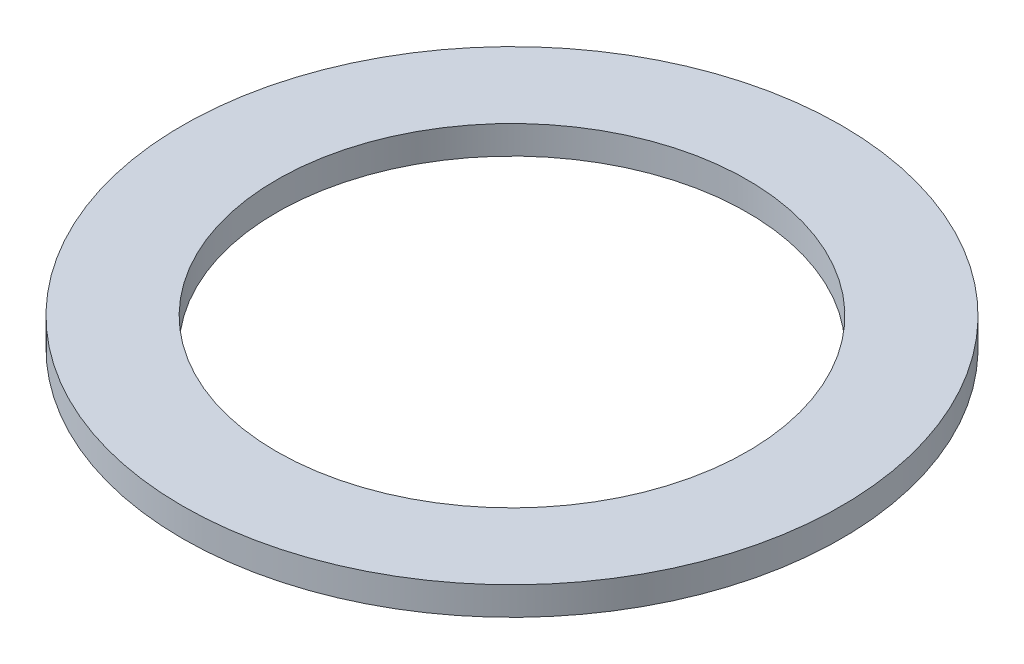
ISO-10303-21;
HEADER;
FILE_DESCRIPTION(('STEP AP214'),'2;1');
FILE_NAME('part.step','',(''),(''),'','','');
FILE_SCHEMA(('AUTOMOTIVE_DESIGN { 1 0 10303 214 1 1 1 1 }'));
ENDSEC;
DATA;
#1=APPLICATION_CONTEXT('core data for automotive mechanical design processes');
#2=APPLICATION_PROTOCOL_DEFINITION('international standard','automotive_design',2000,#1);
#3=PRODUCT_CONTEXT('',#1,'mechanical');
#4=PRODUCT('Part','Part','',(#3));
#5=PRODUCT_RELATED_PRODUCT_CATEGORY('part','',(#4));
#6=PRODUCT_DEFINITION_FORMATION('','',#4);
#7=PRODUCT_DEFINITION_CONTEXT('part definition',#1,'design');
#8=PRODUCT_DEFINITION('design','',#6,#7);
#9=PRODUCT_DEFINITION_SHAPE('','',#8);
#10=(LENGTH_UNIT() NAMED_UNIT(*) SI_UNIT(.MILLI.,.METRE.));
#11=(NAMED_UNIT(*) PLANE_ANGLE_UNIT() SI_UNIT($,.RADIAN.));
#12=(NAMED_UNIT(*) SI_UNIT($,.STERADIAN.) SOLID_ANGLE_UNIT());
#13=UNCERTAINTY_MEASURE_WITH_UNIT(LENGTH_MEASURE(1.E-05),#10,'distance_accuracy_value','');
#14=(GEOMETRIC_REPRESENTATION_CONTEXT(3) GLOBAL_UNCERTAINTY_ASSIGNED_CONTEXT((#13)) GLOBAL_UNIT_ASSIGNED_CONTEXT((#10,
#11,#12)) REPRESENTATION_CONTEXT('',''));
#15=CARTESIAN_POINT('',(0.,0.,0.));
#16=DIRECTION('',(0.,0.,1.));
#17=DIRECTION('',(1.,0.,0.));
#18=AXIS2_PLACEMENT_3D('',#15,#16,#17);
#19=CARTESIAN_POINT('',(0.,0.3,0.));
#20=DIRECTION('',(0.,1.,0.));
#21=DIRECTION('',(0.,0.,1.));
#22=AXIS2_PLACEMENT_3D('',#19,#20,#21);
#23=PLANE('',#22);
#24=CARTESIAN_POINT('',(0.,0.3,0.));
#25=DIRECTION('',(0.,1.,0.));
#26=DIRECTION('',(0.,0.,1.));
#27=AXIS2_PLACEMENT_3D('',#24,#25,#26);
#28=CIRCLE('',#27,3.5);
#29=CARTESIAN_POINT('',(0.,0.3,3.5));
#30=VERTEX_POINT('',#29);
#31=EDGE_CURVE('E10',#30,#30,#28,.T.);
#32=ORIENTED_EDGE('',*,*,#31,.T.);
#33=EDGE_LOOP('',(#32));
#34=FACE_BOUND('',#33,.T.);
#35=CARTESIAN_POINT('',(0.,0.3,0.));
#36=DIRECTION('',(0.,1.,0.));
#37=DIRECTION('',(0.,0.,1.));
#38=AXIS2_PLACEMENT_3D('',#35,#36,#37);
#39=CIRCLE('',#38,2.5);
#40=CARTESIAN_POINT('',(0.,0.3,2.5));
#41=VERTEX_POINT('',#40);
#42=EDGE_CURVE('E50',#41,#41,#39,.T.);
#43=ORIENTED_EDGE('',*,*,#42,.F.);
#44=EDGE_LOOP('',(#43));
#45=FACE_BOUND('',#44,.T.);
#46=ADVANCED_FACE('F37',(#34,#45),#23,.T.);
#47=CARTESIAN_POINT('',(0.,0.,0.));
#48=DIRECTION('',(0.,1.,0.));
#49=DIRECTION('',(0.,0.,1.));
#50=AXIS2_PLACEMENT_3D('',#47,#48,#49);
#51=PLANE('',#50);
#52=CARTESIAN_POINT('',(0.,0.,0.));
#53=DIRECTION('',(0.,1.,0.));
#54=DIRECTION('',(0.,0.,1.));
#55=AXIS2_PLACEMENT_3D('',#52,#53,#54);
#56=CIRCLE('',#55,3.5);
#57=CARTESIAN_POINT('',(0.,0.,3.5));
#58=VERTEX_POINT('',#57);
#59=EDGE_CURVE('E41',#58,#58,#56,.T.);
#60=ORIENTED_EDGE('',*,*,#59,.F.);
#61=EDGE_LOOP('',(#60));
#62=FACE_BOUND('',#61,.T.);
#63=CARTESIAN_POINT('',(0.,0.,0.));
#64=DIRECTION('',(0.,1.,0.));
#65=DIRECTION('',(0.,0.,1.));
#66=AXIS2_PLACEMENT_3D('',#63,#64,#65);
#67=CIRCLE('',#66,2.5);
#68=CARTESIAN_POINT('',(0.,0.,2.5));
#69=VERTEX_POINT('',#68);
#70=EDGE_CURVE('E52',#69,#69,#67,.T.);
#71=ORIENTED_EDGE('',*,*,#70,.T.);
#72=EDGE_LOOP('',(#71));
#73=FACE_BOUND('',#72,.T.);
#74=ADVANCED_FACE('F64',(#62,#73),#51,.F.);
#75=CARTESIAN_POINT('',(0.,0.3,0.));
#76=DIRECTION('',(0.,-1.,0.));
#77=DIRECTION('',(0.,0.,-1.));
#78=AXIS2_PLACEMENT_3D('',#75,#76,#77);
#79=CYLINDRICAL_SURFACE('',#78,3.5);
#80=ORIENTED_EDGE('',*,*,#31,.F.);
#81=EDGE_LOOP('',(#80));
#82=FACE_BOUND('',#81,.T.);
#83=ORIENTED_EDGE('',*,*,#59,.T.);
#84=EDGE_LOOP('',(#83));
#85=FACE_BOUND('',#84,.T.);
#86=ADVANCED_FACE('F39',(#82,#85),#79,.T.);
#87=CARTESIAN_POINT('',(0.,0.3,0.));
#88=DIRECTION('',(0.,-1.,0.));
#89=DIRECTION('',(0.,0.,-1.));
#90=AXIS2_PLACEMENT_3D('',#87,#88,#89);
#91=CYLINDRICAL_SURFACE('',#90,2.5);
#92=ORIENTED_EDGE('',*,*,#42,.T.);
#93=EDGE_LOOP('',(#92));
#94=FACE_BOUND('',#93,.T.);
#95=ORIENTED_EDGE('',*,*,#70,.F.);
#96=EDGE_LOOP('',(#95));
#97=FACE_BOUND('',#96,.T.);
#98=ADVANCED_FACE('F60',(#94,#97),#91,.F.);
#99=CLOSED_SHELL('',(#46,#74,#86,#98));
#100=MANIFOLD_SOLID_BREP('B2',#99);
#101=ADVANCED_BREP_SHAPE_REPRESENTATION('',(#18,#100),#14);
#102=SHAPE_DEFINITION_REPRESENTATION(#9,#101);
ENDSEC;
END-ISO-10303-21;
